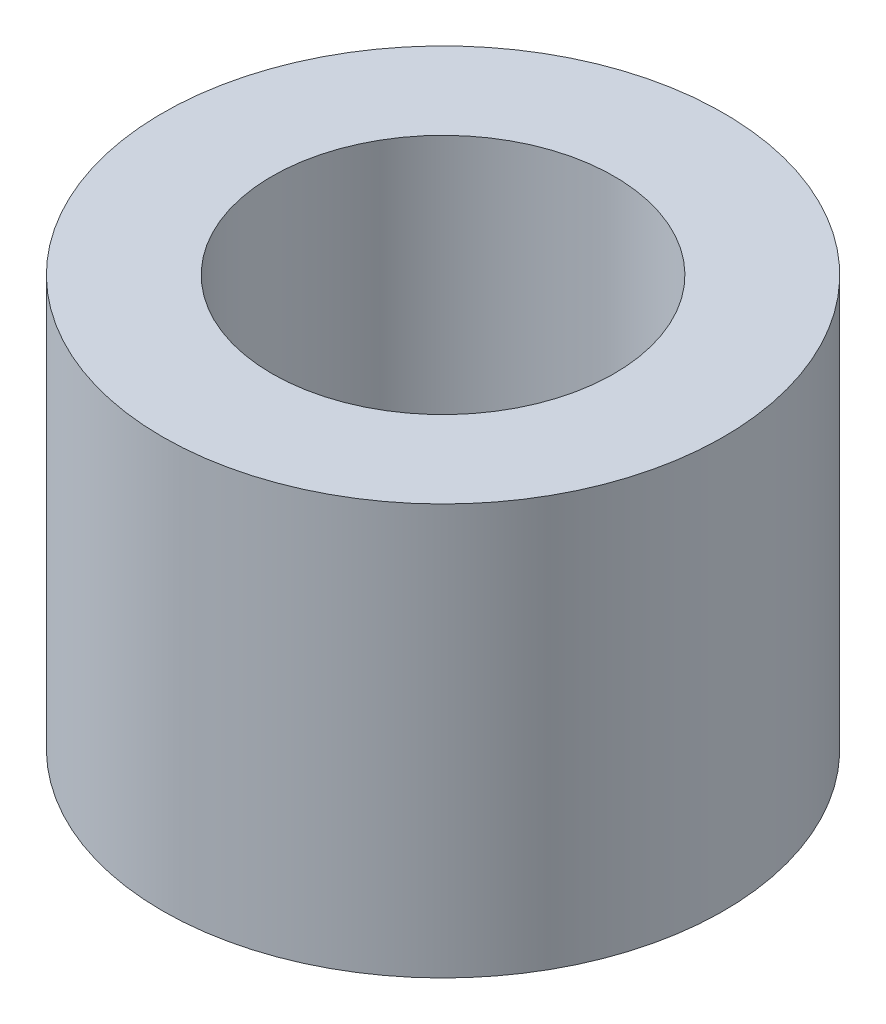
ISO-10303-21;
HEADER;
FILE_DESCRIPTION(('STEP AP214'),'2;1');
FILE_NAME('part.step','',(''),(''),'','','');
FILE_SCHEMA(('AUTOMOTIVE_DESIGN { 1 0 10303 214 1 1 1 1 }'));
ENDSEC;
DATA;
#1=APPLICATION_CONTEXT('core data for automotive mechanical design processes');
#2=APPLICATION_PROTOCOL_DEFINITION('international standard','automotive_design',2000,#1);
#3=PRODUCT_CONTEXT('',#1,'mechanical');
#4=PRODUCT('Part','Part','',(#3));
#5=PRODUCT_RELATED_PRODUCT_CATEGORY('part','',(#4));
#6=PRODUCT_DEFINITION_FORMATION('','',#4);
#7=PRODUCT_DEFINITION_CONTEXT('part definition',#1,'design');
#8=PRODUCT_DEFINITION('design','',#6,#7);
#9=PRODUCT_DEFINITION_SHAPE('','',#8);
#10=(LENGTH_UNIT() NAMED_UNIT(*) SI_UNIT(.MILLI.,.METRE.));
#11=(NAMED_UNIT(*) PLANE_ANGLE_UNIT() SI_UNIT($,.RADIAN.));
#12=(NAMED_UNIT(*) SI_UNIT($,.STERADIAN.) SOLID_ANGLE_UNIT());
#13=UNCERTAINTY_MEASURE_WITH_UNIT(LENGTH_MEASURE(1.E-05),#10,'distance_accuracy_value','');
#14=(GEOMETRIC_REPRESENTATION_CONTEXT(3) GLOBAL_UNCERTAINTY_ASSIGNED_CONTEXT((#13)) GLOBAL_UNIT_ASSIGNED_CONTEXT((#10,
#11,#12)) REPRESENTATION_CONTEXT('',''));
#15=CARTESIAN_POINT('',(0.,0.,0.));
#16=DIRECTION('',(0.,0.,1.));
#17=DIRECTION('',(1.,0.,0.));
#18=AXIS2_PLACEMENT_3D('',#15,#16,#17);
#19=CARTESIAN_POINT('',(0.,22.86,0.));
#20=DIRECTION('',(0.,1.,0.));
#21=DIRECTION('',(0.,0.,1.));
#22=AXIS2_PLACEMENT_3D('',#19,#20,#21);
#23=PLANE('',#22);
#24=CARTESIAN_POINT('',(0.,22.86,0.));
#25=DIRECTION('',(0.,1.,0.));
#26=DIRECTION('',(0.,0.,1.));
#27=AXIS2_PLACEMENT_3D('',#24,#25,#26);
#28=CIRCLE('',#27,15.621);
#29=CARTESIAN_POINT('',(0.,22.86,15.621));
#30=VERTEX_POINT('',#29);
#31=EDGE_CURVE('E10',#30,#30,#28,.T.);
#32=ORIENTED_EDGE('',*,*,#31,.T.);
#33=EDGE_LOOP('',(#32));
#34=FACE_BOUND('',#33,.T.);
#35=CARTESIAN_POINT('',(0.,22.86,0.));
#36=DIRECTION('',(0.,1.,0.));
#37=DIRECTION('',(0.,0.,1.));
#38=AXIS2_PLACEMENT_3D('',#35,#36,#37);
#39=CIRCLE('',#38,9.525);
#40=CARTESIAN_POINT('',(0.,22.86,9.525));
#41=VERTEX_POINT('',#40);
#42=EDGE_CURVE('E42',#41,#41,#39,.T.);
#43=ORIENTED_EDGE('',*,*,#42,.F.);
#44=EDGE_LOOP('',(#43));
#45=FACE_BOUND('',#44,.T.);
#46=ADVANCED_FACE('F31',(#34,#45),#23,.T.);
#47=CARTESIAN_POINT('',(0.,0.,0.));
#48=DIRECTION('',(0.,1.,0.));
#49=DIRECTION('',(0.,0.,1.));
#50=AXIS2_PLACEMENT_3D('',#47,#48,#49);
#51=PLANE('',#50);
#52=CARTESIAN_POINT('',(0.,0.,0.));
#53=DIRECTION('',(0.,1.,0.));
#54=DIRECTION('',(0.,0.,1.));
#55=AXIS2_PLACEMENT_3D('',#52,#53,#54);
#56=CIRCLE('',#55,15.621);
#57=CARTESIAN_POINT('',(0.,0.,15.621));
#58=VERTEX_POINT('',#57);
#59=EDGE_CURVE('E35',#58,#58,#56,.T.);
#60=ORIENTED_EDGE('',*,*,#59,.F.);
#61=EDGE_LOOP('',(#60));
#62=FACE_BOUND('',#61,.T.);
#63=CARTESIAN_POINT('',(0.,0.,0.));
#64=DIRECTION('',(0.,1.,0.));
#65=DIRECTION('',(0.,0.,1.));
#66=AXIS2_PLACEMENT_3D('',#63,#64,#65);
#67=CIRCLE('',#66,9.525);
#68=CARTESIAN_POINT('',(0.,0.,9.525));
#69=VERTEX_POINT('',#68);
#70=EDGE_CURVE('E44',#69,#69,#67,.T.);
#71=ORIENTED_EDGE('',*,*,#70,.T.);
#72=EDGE_LOOP('',(#71));
#73=FACE_BOUND('',#72,.T.);
#74=ADVANCED_FACE('F54',(#62,#73),#51,.F.);
#75=CARTESIAN_POINT('',(0.,22.86,0.));
#76=DIRECTION('',(0.,-1.,0.));
#77=DIRECTION('',(0.,0.,-1.));
#78=AXIS2_PLACEMENT_3D('',#75,#76,#77);
#79=CYLINDRICAL_SURFACE('',#78,15.621);
#80=ORIENTED_EDGE('',*,*,#31,.F.);
#81=EDGE_LOOP('',(#80));
#82=FACE_BOUND('',#81,.T.);
#83=ORIENTED_EDGE('',*,*,#59,.T.);
#84=EDGE_LOOP('',(#83));
#85=FACE_BOUND('',#84,.T.);
#86=ADVANCED_FACE('F33',(#82,#85),#79,.T.);
#87=CARTESIAN_POINT('',(0.,22.86,0.));
#88=DIRECTION('',(0.,-1.,0.));
#89=DIRECTION('',(0.,0.,-1.));
#90=AXIS2_PLACEMENT_3D('',#87,#88,#89);
#91=CYLINDRICAL_SURFACE('',#90,9.525);
#92=ORIENTED_EDGE('',*,*,#42,.T.);
#93=EDGE_LOOP('',(#92));
#94=FACE_BOUND('',#93,.T.);
#95=ORIENTED_EDGE('',*,*,#70,.F.);
#96=EDGE_LOOP('',(#95));
#97=FACE_BOUND('',#96,.T.);
#98=ADVANCED_FACE('F50',(#94,#97),#91,.F.);
#99=CLOSED_SHELL('',(#46,#74,#86,#98));
#100=MANIFOLD_SOLID_BREP('B2',#99);
#101=ADVANCED_BREP_SHAPE_REPRESENTATION('',(#18,#100),#14);
#102=SHAPE_DEFINITION_REPRESENTATION(#9,#101);
ENDSEC;
END-ISO-10303-21;
